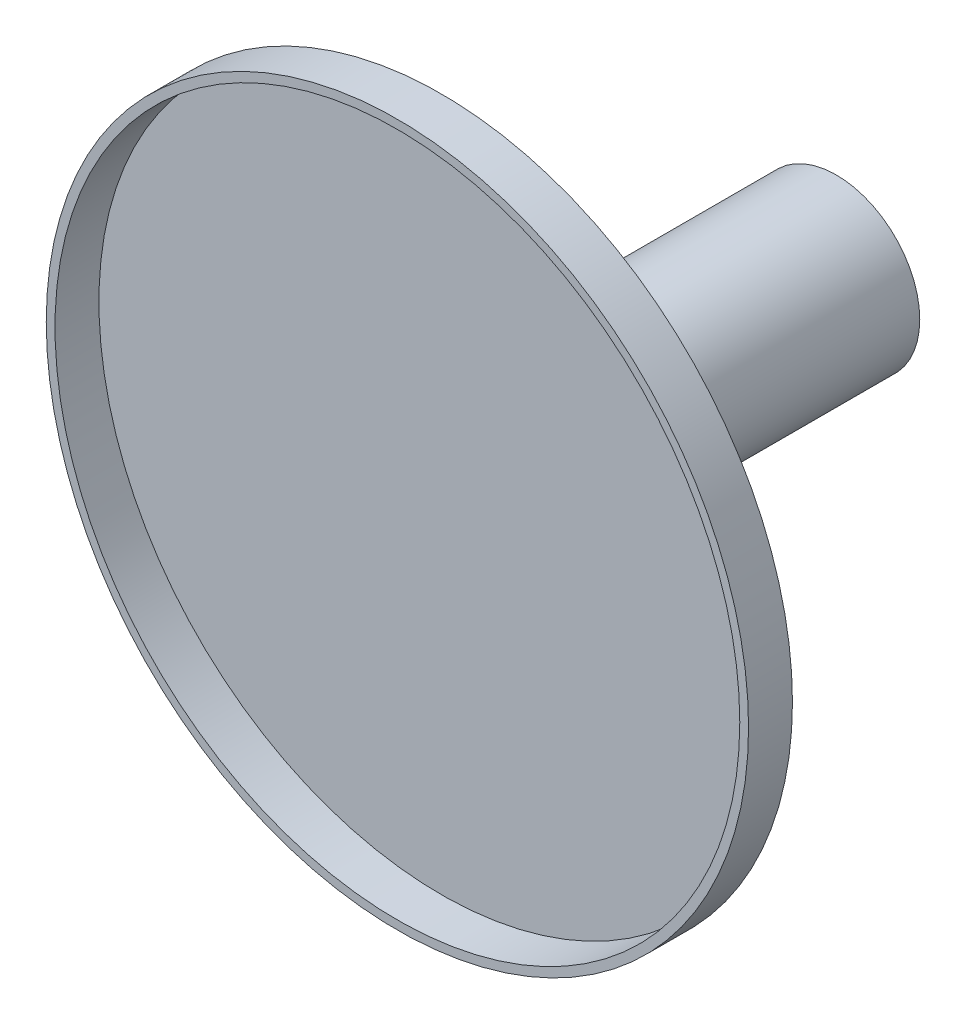
ISO-10303-21;
HEADER;
FILE_DESCRIPTION(('STEP AP214'),'2;1');
FILE_NAME('part.step','',(''),(''),'','','');
FILE_SCHEMA(('AUTOMOTIVE_DESIGN { 1 0 10303 214 1 1 1 1 }'));
ENDSEC;
DATA;
#1=APPLICATION_CONTEXT('core data for automotive mechanical design processes');
#2=APPLICATION_PROTOCOL_DEFINITION('international standard','automotive_design',2000,#1);
#3=PRODUCT_CONTEXT('',#1,'mechanical');
#4=PRODUCT('Part','Part','',(#3));
#5=PRODUCT_RELATED_PRODUCT_CATEGORY('part','',(#4));
#6=PRODUCT_DEFINITION_FORMATION('','',#4);
#7=PRODUCT_DEFINITION_CONTEXT('part definition',#1,'design');
#8=PRODUCT_DEFINITION('design','',#6,#7);
#9=PRODUCT_DEFINITION_SHAPE('','',#8);
#10=(LENGTH_UNIT() NAMED_UNIT(*) SI_UNIT(.MILLI.,.METRE.));
#11=(NAMED_UNIT(*) PLANE_ANGLE_UNIT() SI_UNIT($,.RADIAN.));
#12=(NAMED_UNIT(*) SI_UNIT($,.STERADIAN.) SOLID_ANGLE_UNIT());
#13=UNCERTAINTY_MEASURE_WITH_UNIT(LENGTH_MEASURE(1.E-05),#10,'distance_accuracy_value','');
#14=(GEOMETRIC_REPRESENTATION_CONTEXT(3) GLOBAL_UNCERTAINTY_ASSIGNED_CONTEXT((#13)) GLOBAL_UNIT_ASSIGNED_CONTEXT((#10,
#11,#12)) REPRESENTATION_CONTEXT('',''));
#15=CARTESIAN_POINT('',(0.,0.,0.));
#16=DIRECTION('',(0.,0.,1.));
#17=DIRECTION('',(1.,0.,0.));
#18=AXIS2_PLACEMENT_3D('',#15,#16,#17);
#19=CARTESIAN_POINT('',(0.,0.,12.7));
#20=DIRECTION('',(0.,0.,-1.));
#21=DIRECTION('',(-1.,0.,0.));
#22=AXIS2_PLACEMENT_3D('',#19,#20,#21);
#23=CYLINDRICAL_SURFACE('',#22,101.6);
#24=CARTESIAN_POINT('',(0.,0.,12.7));
#25=DIRECTION('',(0.,0.,1.));
#26=DIRECTION('',(1.,0.,0.));
#27=AXIS2_PLACEMENT_3D('',#24,#25,#26);
#28=CIRCLE('',#27,101.6);
#29=CARTESIAN_POINT('',(101.6,0.,12.7));
#30=VERTEX_POINT('',#29);
#31=EDGE_CURVE('E41',#30,#30,#28,.T.);
#32=ORIENTED_EDGE('',*,*,#31,.F.);
#33=EDGE_LOOP('',(#32));
#34=FACE_BOUND('',#33,.T.);
#35=CARTESIAN_POINT('',(0.,0.,0.));
#36=DIRECTION('',(0.,0.,1.));
#37=DIRECTION('',(1.,0.,0.));
#38=AXIS2_PLACEMENT_3D('',#35,#36,#37);
#39=CIRCLE('',#38,101.6);
#40=CARTESIAN_POINT('',(101.6,0.,0.));
#41=VERTEX_POINT('',#40);
#42=EDGE_CURVE('E93',#41,#41,#39,.T.);
#43=ORIENTED_EDGE('',*,*,#42,.T.);
#44=EDGE_LOOP('',(#43));
#45=FACE_BOUND('',#44,.T.);
#46=ADVANCED_FACE('F33',(#34,#45),#23,.T.);
#47=CARTESIAN_POINT('',(0.,0.,12.7));
#48=DIRECTION('',(0.,0.,1.));
#49=DIRECTION('',(1.,0.,0.));
#50=AXIS2_PLACEMENT_3D('',#47,#48,#49);
#51=PLANE('',#50);
#52=CARTESIAN_POINT('',(0.,0.,12.7));
#53=DIRECTION('',(0.,0.,1.));
#54=DIRECTION('',(1.,0.,0.));
#55=AXIS2_PLACEMENT_3D('',#52,#53,#54);
#56=CIRCLE('',#55,99.06);
#57=CARTESIAN_POINT('',(99.06,0.,12.7));
#58=VERTEX_POINT('',#57);
#59=EDGE_CURVE('E96',#58,#58,#56,.T.);
#60=ORIENTED_EDGE('',*,*,#59,.F.);
#61=EDGE_LOOP('',(#60));
#62=FACE_BOUND('',#61,.T.);
#63=ORIENTED_EDGE('',*,*,#31,.T.);
#64=EDGE_LOOP('',(#63));
#65=FACE_BOUND('',#64,.T.);
#66=ADVANCED_FACE('F106',(#62,#65),#51,.T.);
#67=CARTESIAN_POINT('',(0.,0.,-25.4));
#68=DIRECTION('',(0.,0.,1.));
#69=DIRECTION('',(1.,0.,0.));
#70=AXIS2_PLACEMENT_3D('',#67,#68,#69);
#71=CYLINDRICAL_SURFACE('',#70,99.06);
#72=CARTESIAN_POINT('',(0.,0.,0.));
#73=DIRECTION('',(0.,0.,1.));
#74=DIRECTION('',(1.,0.,0.));
#75=AXIS2_PLACEMENT_3D('',#72,#73,#74);
#76=CIRCLE('',#75,99.06);
#77=CARTESIAN_POINT('',(99.06,0.,0.));
#78=VERTEX_POINT('',#77);
#79=EDGE_CURVE('E46',#78,#78,#76,.T.);
#80=CARTESIAN_POINT('',(99.06,0.,12.7));
#81=CARTESIAN_POINT('',(99.06,0.,12.5677083333333));
#82=CARTESIAN_POINT('',(99.06,0.,12.4354166666667));
#83=CARTESIAN_POINT('',(99.06,0.,12.1708333333333));
#84=CARTESIAN_POINT('',(99.06,0.,12.0385416666667));
#85=CARTESIAN_POINT('',(99.06,0.,11.7739583333333));
#86=CARTESIAN_POINT('',(99.06,0.,11.6416666666667));
#87=CARTESIAN_POINT('',(99.06,0.,11.3770833333333));
#88=CARTESIAN_POINT('',(99.06,0.,11.2447916666667));
#89=CARTESIAN_POINT('',(99.06,0.,10.9802083333333));
#90=CARTESIAN_POINT('',(99.06,0.,10.8479166666667));
#91=CARTESIAN_POINT('',(99.06,0.,10.5833333333333));
#92=CARTESIAN_POINT('',(99.06,0.,10.4510416666667));
#93=CARTESIAN_POINT('',(99.06,0.,10.1864583333333));
#94=CARTESIAN_POINT('',(99.06,0.,10.0541666666667));
#95=CARTESIAN_POINT('',(99.06,0.,9.78958333333333));
#96=CARTESIAN_POINT('',(99.06,0.,9.65729166666667));
#97=CARTESIAN_POINT('',(99.06,0.,9.39270833333333));
#98=CARTESIAN_POINT('',(99.06,0.,9.26041666666666));
#99=CARTESIAN_POINT('',(99.06,0.,8.99583333333333));
#100=CARTESIAN_POINT('',(99.06,0.,8.86354166666666));
#101=CARTESIAN_POINT('',(99.06,0.,8.59895833333333));
#102=CARTESIAN_POINT('',(99.06,0.,8.46666666666667));
#103=CARTESIAN_POINT('',(99.06,0.,8.20208333333333));
#104=CARTESIAN_POINT('',(99.06,0.,8.06979166666666));
#105=CARTESIAN_POINT('',(99.06,0.,7.80520833333333));
#106=CARTESIAN_POINT('',(99.06,0.,7.67291666666666));
#107=CARTESIAN_POINT('',(99.06,0.,7.40833333333333));
#108=CARTESIAN_POINT('',(99.06,0.,7.27604166666667));
#109=CARTESIAN_POINT('',(99.06,0.,7.01145833333333));
#110=CARTESIAN_POINT('',(99.06,0.,6.87916666666666));
#111=CARTESIAN_POINT('',(99.06,0.,6.61458333333333));
#112=CARTESIAN_POINT('',(99.06,0.,6.48229166666666));
#113=CARTESIAN_POINT('',(99.06,0.,6.21770833333333));
#114=CARTESIAN_POINT('',(99.06,0.,6.08541666666667));
#115=CARTESIAN_POINT('',(99.06,0.,5.82083333333333));
#116=CARTESIAN_POINT('',(99.06,0.,5.68854166666667));
#117=CARTESIAN_POINT('',(99.06,0.,5.42395833333333));
#118=CARTESIAN_POINT('',(99.06,0.,5.29166666666667));
#119=CARTESIAN_POINT('',(99.06,0.,5.02708333333333));
#120=CARTESIAN_POINT('',(99.06,0.,4.89479166666667));
#121=CARTESIAN_POINT('',(99.06,0.,4.63020833333334));
#122=CARTESIAN_POINT('',(99.06,0.,4.49791666666667));
#123=CARTESIAN_POINT('',(99.06,0.,4.23333333333333));
#124=CARTESIAN_POINT('',(99.06,0.,4.10104166666667));
#125=CARTESIAN_POINT('',(99.06,0.,3.83645833333333));
#126=CARTESIAN_POINT('',(99.06,0.,3.70416666666667));
#127=CARTESIAN_POINT('',(99.06,0.,3.43958333333333));
#128=CARTESIAN_POINT('',(99.06,0.,3.30729166666667));
#129=CARTESIAN_POINT('',(99.06,0.,3.04270833333333));
#130=CARTESIAN_POINT('',(99.06,0.,2.91041666666667));
#131=CARTESIAN_POINT('',(99.06,0.,2.64583333333333));
#132=CARTESIAN_POINT('',(99.06,0.,2.51354166666667));
#133=CARTESIAN_POINT('',(99.06,0.,2.24895833333333));
#134=CARTESIAN_POINT('',(99.06,0.,2.11666666666667));
#135=CARTESIAN_POINT('',(99.06,0.,1.85208333333333));
#136=CARTESIAN_POINT('',(99.06,0.,1.71979166666667));
#137=CARTESIAN_POINT('',(99.06,0.,1.45520833333333));
#138=CARTESIAN_POINT('',(99.06,0.,1.32291666666667));
#139=CARTESIAN_POINT('',(99.06,0.,1.05833333333333));
#140=CARTESIAN_POINT('',(99.06,0.,0.926041666666666));
#141=CARTESIAN_POINT('',(99.06,0.,0.661458333333332));
#142=CARTESIAN_POINT('',(99.06,0.,0.529166666666665));
#143=CARTESIAN_POINT('',(99.06,0.,0.264583333333332));
#144=CARTESIAN_POINT('',(99.06,0.,0.132291666666666));
#145=CARTESIAN_POINT('',(99.06,0.,0.));
#146=B_SPLINE_CURVE_WITH_KNOTS('',3,(#80,#81,#82,#83,#84,#85,#86,#87,#88,#89,#90,#91,#92,#93,
#94,#95,#96,#97,#98,#99,#100,#101,#102,#103,#104,#105,#106,#107,#108,#109,#110,#111,#112,#113,
#114,#115,#116,#117,#118,#119,#120,#121,#122,#123,#124,#125,#126,#127,#128,#129,#130,#131,#132,
#133,#134,#135,#136,#137,#138,#139,#140,#141,#142,#143,#144,#145),.UNSPECIFIED.,.F.,.F.,(4,2,2,
2,2,2,2,2,2,2,2,2,2,2,2,2,2,2,2,2,2,2,2,2,2,2,2,2,2,2,2,2,4),(0.,0.396874999999998,
0.793750000000003,1.190625,1.5875,1.984375,2.38125,2.778125,3.175,3.571875,3.96875,4.365625,
4.7625,5.159375,5.55625,5.953125,6.35,6.746875,7.14375,7.540625,7.9375,8.334375,8.73125,
9.128125,9.525,9.921875,10.31875,10.715625,11.1125,11.509375,11.90625,12.303125,12.7),.UNSPECIFIED.);
#147=EDGE_CURVE('BSEAM104',#58,#78,#146,.T.);
#148=ORIENTED_EDGE('',*,*,#59,.T.);
#149=ORIENTED_EDGE('',*,*,#79,.F.);
#150=ORIENTED_EDGE('',*,*,#147,.T.);
#151=ORIENTED_EDGE('',*,*,#147,.F.);
#152=EDGE_LOOP('',(#148,#150,#149,#151));
#153=FACE_BOUND('',#152,.T.);
#154=ADVANCED_FACE('F104',(#153),#71,.F.);
#155=CARTESIAN_POINT('',(0.,0.,0.));
#156=DIRECTION('',(0.,0.,1.));
#157=DIRECTION('',(1.,0.,0.));
#158=AXIS2_PLACEMENT_3D('',#155,#156,#157);
#159=PLANE('',#158);
#160=ORIENTED_EDGE('',*,*,#79,.T.);
#161=EDGE_LOOP('',(#160));
#162=FACE_BOUND('',#161,.T.);
#163=ADVANCED_FACE('F78',(#162),#159,.T.);
#164=CARTESIAN_POINT('',(0.,0.,-38.1));
#165=DIRECTION('',(0.,0.,1.));
#166=DIRECTION('',(1.,0.,0.));
#167=AXIS2_PLACEMENT_3D('',#164,#165,#166);
#168=CONICAL_SURFACE('',#167,24.13,1.11372757024711);
#169=CARTESIAN_POINT('',(0.,0.,-38.1));
#170=DIRECTION('',(0.,0.,-1.));
#171=DIRECTION('',(-1.,0.,0.));
#172=AXIS2_PLACEMENT_3D('',#169,#170,#171);
#173=CIRCLE('',#172,24.13);
#174=CARTESIAN_POINT('',(24.13,0.,-38.1));
#175=VERTEX_POINT('',#174);
#176=EDGE_CURVE('E36',#175,#175,#173,.T.);
#177=CARTESIAN_POINT('',(24.13,0.,-38.1));
#178=CARTESIAN_POINT('',(24.9369791666667,0.,-37.703125));
#179=CARTESIAN_POINT('',(25.7439583333333,0.,-37.30625));
#180=CARTESIAN_POINT('',(27.3579166666667,0.,-36.5125));
#181=CARTESIAN_POINT('',(28.1648958333333,0.,-36.115625));
#182=CARTESIAN_POINT('',(29.7788541666667,0.,-35.321875));
#183=CARTESIAN_POINT('',(30.5858333333333,0.,-34.925));
#184=CARTESIAN_POINT('',(32.1997916666667,0.,-34.13125));
#185=CARTESIAN_POINT('',(33.0067708333333,0.,-33.734375));
#186=CARTESIAN_POINT('',(34.6207291666667,0.,-32.940625));
#187=CARTESIAN_POINT('',(35.4277083333333,0.,-32.54375));
#188=CARTESIAN_POINT('',(37.0416666666667,0.,-31.75));
#189=CARTESIAN_POINT('',(37.8486458333333,0.,-31.353125));
#190=CARTESIAN_POINT('',(39.4626041666667,0.,-30.559375));
#191=CARTESIAN_POINT('',(40.2695833333333,0.,-30.1625));
#192=CARTESIAN_POINT('',(41.8835416666667,0.,-29.36875));
#193=CARTESIAN_POINT('',(42.6905208333333,0.,-28.971875));
#194=CARTESIAN_POINT('',(44.3044791666667,0.,-28.178125));
#195=CARTESIAN_POINT('',(45.1114583333333,0.,-27.78125));
#196=CARTESIAN_POINT('',(46.7254166666667,0.,-26.9875));
#197=CARTESIAN_POINT('',(47.5323958333333,0.,-26.590625));
#198=CARTESIAN_POINT('',(49.1463541666667,0.,-25.796875));
#199=CARTESIAN_POINT('',(49.9533333333333,0.,-25.4));
#200=CARTESIAN_POINT('',(51.5672916666667,0.,-24.60625));
#201=CARTESIAN_POINT('',(52.3742708333333,0.,-24.209375));
#202=CARTESIAN_POINT('',(53.9882291666667,0.,-23.415625));
#203=CARTESIAN_POINT('',(54.7952083333333,0.,-23.01875));
#204=CARTESIAN_POINT('',(56.4091666666667,0.,-22.225));
#205=CARTESIAN_POINT('',(57.2161458333333,0.,-21.828125));
#206=CARTESIAN_POINT('',(58.8301041666667,0.,-21.034375));
#207=CARTESIAN_POINT('',(59.6370833333333,0.,-20.6375));
#208=CARTESIAN_POINT('',(61.2510416666667,0.,-19.84375));
#209=CARTESIAN_POINT('',(62.0580208333333,0.,-19.446875));
#210=CARTESIAN_POINT('',(63.6719791666667,0.,-18.653125));
#211=CARTESIAN_POINT('',(64.4789583333333,0.,-18.25625));
#212=CARTESIAN_POINT('',(66.0929166666667,0.,-17.4625));
#213=CARTESIAN_POINT('',(66.8998958333333,0.,-17.065625));
#214=CARTESIAN_POINT('',(68.5138541666666,0.,-16.271875));
#215=CARTESIAN_POINT('',(69.3208333333333,0.,-15.875));
#216=CARTESIAN_POINT('',(70.9347916666667,0.,-15.08125));
#217=CARTESIAN_POINT('',(71.7417708333333,0.,-14.684375));
#218=CARTESIAN_POINT('',(73.3557291666667,0.,-13.890625));
#219=CARTESIAN_POINT('',(74.1627083333333,0.,-13.49375));
#220=CARTESIAN_POINT('',(75.7766666666667,0.,-12.7));
#221=CARTESIAN_POINT('',(76.5836458333333,0.,-12.303125));
#222=CARTESIAN_POINT('',(78.1976041666667,0.,-11.509375));
#223=CARTESIAN_POINT('',(79.0045833333333,0.,-11.1125));
#224=CARTESIAN_POINT('',(80.6185416666667,0.,-10.31875));
#225=CARTESIAN_POINT('',(81.4255208333333,0.,-9.92187500000001));
#226=CARTESIAN_POINT('',(83.0394791666667,0.,-9.12812500000001));
#227=CARTESIAN_POINT('',(83.8464583333333,0.,-8.73125000000001));
#228=CARTESIAN_POINT('',(85.4604166666666,0.,-7.93750000000001));
#229=CARTESIAN_POINT('',(86.2673958333333,0.,-7.54062500000001));
#230=CARTESIAN_POINT('',(87.8813541666667,0.,-6.74687500000001));
#231=CARTESIAN_POINT('',(88.6883333333333,0.,-6.35));
#232=CARTESIAN_POINT('',(90.3022916666667,0.,-5.55625));
#233=CARTESIAN_POINT('',(91.1092708333333,0.,-5.159375));
#234=CARTESIAN_POINT('',(92.7232291666667,0.,-4.365625));
#235=CARTESIAN_POINT('',(93.5302083333333,0.,-3.96875000000001));
#236=CARTESIAN_POINT('',(95.1441666666666,0.,-3.17500000000001));
#237=CARTESIAN_POINT('',(95.9511458333333,0.,-2.77812500000001));
#238=CARTESIAN_POINT('',(97.5651041666667,0.,-1.98437500000001));
#239=CARTESIAN_POINT('',(98.3720833333333,0.,-1.58750000000001));
#240=CARTESIAN_POINT('',(99.9860416666667,0.,-0.793750000000007));
#241=CARTESIAN_POINT('',(100.793020833333,0.,-0.396875000000006));
#242=CARTESIAN_POINT('',(101.6,0.,0.));
#243=B_SPLINE_CURVE_WITH_KNOTS('',3,(#177,#178,#179,#180,#181,#182,#183,#184,#185,#186,#187,
#188,#189,#190,#191,#192,#193,#194,#195,#196,#197,#198,#199,#200,#201,#202,#203,#204,#205,#206,
#207,#208,#209,#210,#211,#212,#213,#214,#215,#216,#217,#218,#219,#220,#221,#222,#223,#224,#225,
#226,#227,#228,#229,#230,#231,#232,#233,#234,#235,#236,#237,#238,#239,#240,#241,#242),
.UNSPECIFIED.,.F.,.F.,(4,2,2,2,2,2,2,2,2,2,2,2,2,2,2,2,2,2,2,2,2,2,2,2,2,2,2,2,2,2,2,2,4),(0.,
2.69787439839797,5.39574879679595,8.09362319519393,10.7914975935919,13.4893719919899,
16.1872463903879,18.8851207887858,21.5829951871838,24.2808695855818,26.9787439839798,
29.6766183823777,32.3744927807757,35.0723671791737,37.7702415775717,40.4681159759697,
43.1659903743676,45.8638647727656,48.5617391711636,51.2596135695616,53.9574879679596,
56.6553623663575,59.3532367647555,62.0511111631535,64.7489855615515,67.4468599599494,
70.1447343583474,72.8426087567454,75.5404831551434,78.2383575535413,80.9362319519393,
83.6341063503373,86.3319807487352),.UNSPECIFIED.);
#244=EDGE_CURVE('BSEAM74',#175,#41,#243,.T.);
#245=ORIENTED_EDGE('',*,*,#176,.F.);
#246=ORIENTED_EDGE('',*,*,#42,.F.);
#247=ORIENTED_EDGE('',*,*,#244,.T.);
#248=ORIENTED_EDGE('',*,*,#244,.F.);
#249=EDGE_LOOP('',(#245,#247,#246,#248));
#250=FACE_BOUND('',#249,.T.);
#251=ADVANCED_FACE('F74',(#250),#168,.T.);
#252=CARTESIAN_POINT('',(0.,0.,-114.3));
#253=DIRECTION('',(0.,0.,-1.));
#254=DIRECTION('',(-1.,0.,0.));
#255=AXIS2_PLACEMENT_3D('',#252,#253,#254);
#256=PLANE('',#255);
#257=CARTESIAN_POINT('',(0.,0.,-114.3));
#258=DIRECTION('',(0.,0.,-1.));
#259=DIRECTION('',(-1.,0.,0.));
#260=AXIS2_PLACEMENT_3D('',#257,#258,#259);
#261=CIRCLE('',#260,24.13);
#262=CARTESIAN_POINT('',(24.13,0.,-114.3));
#263=VERTEX_POINT('',#262);
#264=EDGE_CURVE('E177',#263,#263,#261,.T.);
#265=ORIENTED_EDGE('',*,*,#264,.T.);
#266=EDGE_LOOP('',(#265));
#267=FACE_BOUND('',#266,.T.);
#268=CARTESIAN_POINT('',(0.,0.,-114.3));
#269=DIRECTION('',(0.,0.,-1.));
#270=DIRECTION('',(-1.,0.,0.));
#271=AXIS2_PLACEMENT_3D('',#268,#269,#270);
#272=CIRCLE('',#271,20.828);
#273=CARTESIAN_POINT('',(20.828,0.,-114.3));
#274=VERTEX_POINT('',#273);
#275=EDGE_CURVE('E175',#274,#274,#272,.T.);
#276=ORIENTED_EDGE('',*,*,#275,.F.);
#277=EDGE_LOOP('',(#276));
#278=FACE_BOUND('',#277,.T.);
#279=ADVANCED_FACE('F67',(#267,#278),#256,.T.);
#280=CARTESIAN_POINT('',(0.,0.,-114.3));
#281=DIRECTION('',(0.,0.,1.));
#282=DIRECTION('',(1.,0.,0.));
#283=AXIS2_PLACEMENT_3D('',#280,#281,#282);
#284=CYLINDRICAL_SURFACE('',#283,24.13);
#285=CARTESIAN_POINT('',(24.13,0.,-114.3));
#286=CARTESIAN_POINT('',(24.13,0.,-113.50625));
#287=CARTESIAN_POINT('',(24.13,0.,-112.7125));
#288=CARTESIAN_POINT('',(24.13,0.,-111.125));
#289=CARTESIAN_POINT('',(24.13,0.,-110.33125));
#290=CARTESIAN_POINT('',(24.13,0.,-108.74375));
#291=CARTESIAN_POINT('',(24.13,0.,-107.95));
#292=CARTESIAN_POINT('',(24.13,0.,-106.3625));
#293=CARTESIAN_POINT('',(24.13,0.,-105.56875));
#294=CARTESIAN_POINT('',(24.13,0.,-103.98125));
#295=CARTESIAN_POINT('',(24.13,0.,-103.1875));
#296=CARTESIAN_POINT('',(24.13,0.,-101.6));
#297=CARTESIAN_POINT('',(24.13,0.,-100.80625));
#298=CARTESIAN_POINT('',(24.13,0.,-99.21875));
#299=CARTESIAN_POINT('',(24.13,0.,-98.425));
#300=CARTESIAN_POINT('',(24.13,0.,-96.8375));
#301=CARTESIAN_POINT('',(24.13,0.,-96.04375));
#302=CARTESIAN_POINT('',(24.13,0.,-94.45625));
#303=CARTESIAN_POINT('',(24.13,0.,-93.6625));
#304=CARTESIAN_POINT('',(24.13,0.,-92.075));
#305=CARTESIAN_POINT('',(24.13,0.,-91.28125));
#306=CARTESIAN_POINT('',(24.13,0.,-89.69375));
#307=CARTESIAN_POINT('',(24.13,0.,-88.9));
#308=CARTESIAN_POINT('',(24.13,0.,-87.3125));
#309=CARTESIAN_POINT('',(24.13,0.,-86.51875));
#310=CARTESIAN_POINT('',(24.13,0.,-84.93125));
#311=CARTESIAN_POINT('',(24.13,0.,-84.1375));
#312=CARTESIAN_POINT('',(24.13,0.,-82.55));
#313=CARTESIAN_POINT('',(24.13,0.,-81.75625));
#314=CARTESIAN_POINT('',(24.13,0.,-80.16875));
#315=CARTESIAN_POINT('',(24.13,0.,-79.375));
#316=CARTESIAN_POINT('',(24.13,0.,-77.7875));
#317=CARTESIAN_POINT('',(24.13,0.,-76.99375));
#318=CARTESIAN_POINT('',(24.13,0.,-75.40625));
#319=CARTESIAN_POINT('',(24.13,0.,-74.6125));
#320=CARTESIAN_POINT('',(24.13,0.,-73.025));
#321=CARTESIAN_POINT('',(24.13,0.,-72.23125));
#322=CARTESIAN_POINT('',(24.13,0.,-70.64375));
#323=CARTESIAN_POINT('',(24.13,0.,-69.85));
#324=CARTESIAN_POINT('',(24.13,0.,-68.2625));
#325=CARTESIAN_POINT('',(24.13,0.,-67.46875));
#326=CARTESIAN_POINT('',(24.13,0.,-65.88125));
#327=CARTESIAN_POINT('',(24.13,0.,-65.0875));
#328=CARTESIAN_POINT('',(24.13,0.,-63.5));
#329=CARTESIAN_POINT('',(24.13,0.,-62.70625));
#330=CARTESIAN_POINT('',(24.13,0.,-61.11875));
#331=CARTESIAN_POINT('',(24.13,0.,-60.325));
#332=CARTESIAN_POINT('',(24.13,0.,-58.7375));
#333=CARTESIAN_POINT('',(24.13,0.,-57.94375));
#334=CARTESIAN_POINT('',(24.13,0.,-56.35625));
#335=CARTESIAN_POINT('',(24.13,0.,-55.5625));
#336=CARTESIAN_POINT('',(24.13,0.,-53.975));
#337=CARTESIAN_POINT('',(24.13,0.,-53.18125));
#338=CARTESIAN_POINT('',(24.13,0.,-51.59375));
#339=CARTESIAN_POINT('',(24.13,0.,-50.8));
#340=CARTESIAN_POINT('',(24.13,0.,-49.2125));
#341=CARTESIAN_POINT('',(24.13,0.,-48.41875));
#342=CARTESIAN_POINT('',(24.13,0.,-46.83125));
#343=CARTESIAN_POINT('',(24.13,0.,-46.0375));
#344=CARTESIAN_POINT('',(24.13,0.,-44.45));
#345=CARTESIAN_POINT('',(24.13,0.,-43.65625));
#346=CARTESIAN_POINT('',(24.13,0.,-42.06875));
#347=CARTESIAN_POINT('',(24.13,0.,-41.275));
#348=CARTESIAN_POINT('',(24.13,0.,-39.6875));
#349=CARTESIAN_POINT('',(24.13,0.,-38.89375));
#350=CARTESIAN_POINT('',(24.13,0.,-38.1));
#351=B_SPLINE_CURVE_WITH_KNOTS('',3,(#285,#286,#287,#288,#289,#290,#291,#292,#293,#294,#295,
#296,#297,#298,#299,#300,#301,#302,#303,#304,#305,#306,#307,#308,#309,#310,#311,#312,#313,#314,
#315,#316,#317,#318,#319,#320,#321,#322,#323,#324,#325,#326,#327,#328,#329,#330,#331,#332,#333,
#334,#335,#336,#337,#338,#339,#340,#341,#342,#343,#344,#345,#346,#347,#348,#349,#350),
.UNSPECIFIED.,.F.,.F.,(4,2,2,2,2,2,2,2,2,2,2,2,2,2,2,2,2,2,2,2,2,2,2,2,2,2,2,2,2,2,2,2,4),(0.,
2.38125,4.7625,7.14375,9.52500000000001,11.90625,14.2875,16.66875,19.05,21.43125,23.8125,
26.19375,28.575,30.95625,33.3375,35.71875,38.1,40.48125,42.8625,45.24375,47.625,50.00625,
52.3875,54.76875,57.15,59.53125,61.9125,64.29375,66.675,69.05625,71.4375,73.81875,76.2),.UNSPECIFIED.);
#352=EDGE_CURVE('BSEAM56',#263,#175,#351,.T.);
#353=ORIENTED_EDGE('',*,*,#264,.F.);
#354=ORIENTED_EDGE('',*,*,#176,.T.);
#355=ORIENTED_EDGE('',*,*,#352,.T.);
#356=ORIENTED_EDGE('',*,*,#352,.F.);
#357=EDGE_LOOP('',(#353,#355,#354,#356));
#358=FACE_BOUND('',#357,.T.);
#359=ADVANCED_FACE('F56',(#358),#284,.T.);
#360=CARTESIAN_POINT('',(0.,0.,-114.3));
#361=DIRECTION('',(0.,0.,1.));
#362=DIRECTION('',(1.,0.,0.));
#363=AXIS2_PLACEMENT_3D('',#360,#361,#362);
#364=CYLINDRICAL_SURFACE('',#363,20.828);
#365=CARTESIAN_POINT('',(0.,0.,-38.1));
#366=DIRECTION('',(0.,0.,-1.));
#367=DIRECTION('',(-1.,0.,0.));
#368=AXIS2_PLACEMENT_3D('',#365,#366,#367);
#369=CIRCLE('',#368,20.828);
#370=CARTESIAN_POINT('',(20.828,0.,-38.1));
#371=VERTEX_POINT('',#370);
#372=EDGE_CURVE('E11',#371,#371,#369,.F.);
#373=CARTESIAN_POINT('',(20.828,0.,-114.3));
#374=CARTESIAN_POINT('',(20.828,0.,-113.50625));
#375=CARTESIAN_POINT('',(20.828,0.,-112.7125));
#376=CARTESIAN_POINT('',(20.828,0.,-111.125));
#377=CARTESIAN_POINT('',(20.828,0.,-110.33125));
#378=CARTESIAN_POINT('',(20.828,0.,-108.74375));
#379=CARTESIAN_POINT('',(20.828,0.,-107.95));
#380=CARTESIAN_POINT('',(20.828,0.,-106.3625));
#381=CARTESIAN_POINT('',(20.828,0.,-105.56875));
#382=CARTESIAN_POINT('',(20.828,0.,-103.98125));
#383=CARTESIAN_POINT('',(20.828,0.,-103.1875));
#384=CARTESIAN_POINT('',(20.828,0.,-101.6));
#385=CARTESIAN_POINT('',(20.828,0.,-100.80625));
#386=CARTESIAN_POINT('',(20.828,0.,-99.21875));
#387=CARTESIAN_POINT('',(20.828,0.,-98.425));
#388=CARTESIAN_POINT('',(20.828,0.,-96.8375));
#389=CARTESIAN_POINT('',(20.828,0.,-96.04375));
#390=CARTESIAN_POINT('',(20.828,0.,-94.45625));
#391=CARTESIAN_POINT('',(20.828,0.,-93.6625));
#392=CARTESIAN_POINT('',(20.828,0.,-92.075));
#393=CARTESIAN_POINT('',(20.828,0.,-91.28125));
#394=CARTESIAN_POINT('',(20.828,0.,-89.69375));
#395=CARTESIAN_POINT('',(20.828,0.,-88.9));
#396=CARTESIAN_POINT('',(20.828,0.,-87.3125));
#397=CARTESIAN_POINT('',(20.828,0.,-86.51875));
#398=CARTESIAN_POINT('',(20.828,0.,-84.93125));
#399=CARTESIAN_POINT('',(20.828,0.,-84.1375));
#400=CARTESIAN_POINT('',(20.828,0.,-82.55));
#401=CARTESIAN_POINT('',(20.828,0.,-81.75625));
#402=CARTESIAN_POINT('',(20.828,0.,-80.16875));
#403=CARTESIAN_POINT('',(20.828,0.,-79.375));
#404=CARTESIAN_POINT('',(20.828,0.,-77.7875));
#405=CARTESIAN_POINT('',(20.828,0.,-76.99375));
#406=CARTESIAN_POINT('',(20.828,0.,-75.40625));
#407=CARTESIAN_POINT('',(20.828,0.,-74.6125));
#408=CARTESIAN_POINT('',(20.828,0.,-73.025));
#409=CARTESIAN_POINT('',(20.828,0.,-72.23125));
#410=CARTESIAN_POINT('',(20.828,0.,-70.64375));
#411=CARTESIAN_POINT('',(20.828,0.,-69.85));
#412=CARTESIAN_POINT('',(20.828,0.,-68.2625));
#413=CARTESIAN_POINT('',(20.828,0.,-67.46875));
#414=CARTESIAN_POINT('',(20.828,0.,-65.88125));
#415=CARTESIAN_POINT('',(20.828,0.,-65.0875));
#416=CARTESIAN_POINT('',(20.828,0.,-63.5));
#417=CARTESIAN_POINT('',(20.828,0.,-62.70625));
#418=CARTESIAN_POINT('',(20.828,0.,-61.11875));
#419=CARTESIAN_POINT('',(20.828,0.,-60.325));
#420=CARTESIAN_POINT('',(20.828,0.,-58.7375));
#421=CARTESIAN_POINT('',(20.828,0.,-57.94375));
#422=CARTESIAN_POINT('',(20.828,0.,-56.35625));
#423=CARTESIAN_POINT('',(20.828,0.,-55.5625));
#424=CARTESIAN_POINT('',(20.828,0.,-53.975));
#425=CARTESIAN_POINT('',(20.828,0.,-53.18125));
#426=CARTESIAN_POINT('',(20.828,0.,-51.59375));
#427=CARTESIAN_POINT('',(20.828,0.,-50.8));
#428=CARTESIAN_POINT('',(20.828,0.,-49.2125));
#429=CARTESIAN_POINT('',(20.828,0.,-48.41875));
#430=CARTESIAN_POINT('',(20.828,0.,-46.83125));
#431=CARTESIAN_POINT('',(20.828,0.,-46.0375));
#432=CARTESIAN_POINT('',(20.828,0.,-44.45));
#433=CARTESIAN_POINT('',(20.828,0.,-43.65625));
#434=CARTESIAN_POINT('',(20.828,0.,-42.06875));
#435=CARTESIAN_POINT('',(20.828,0.,-41.275));
#436=CARTESIAN_POINT('',(20.828,0.,-39.6875));
#437=CARTESIAN_POINT('',(20.828,0.,-38.89375));
#438=CARTESIAN_POINT('',(20.828,0.,-38.1));
#439=B_SPLINE_CURVE_WITH_KNOTS('',3,(#373,#374,#375,#376,#377,#378,#379,#380,#381,#382,#383,
#384,#385,#386,#387,#388,#389,#390,#391,#392,#393,#394,#395,#396,#397,#398,#399,#400,#401,#402,
#403,#404,#405,#406,#407,#408,#409,#410,#411,#412,#413,#414,#415,#416,#417,#418,#419,#420,#421,
#422,#423,#424,#425,#426,#427,#428,#429,#430,#431,#432,#433,#434,#435,#436,#437,#438),
.UNSPECIFIED.,.F.,.F.,(4,2,2,2,2,2,2,2,2,2,2,2,2,2,2,2,2,2,2,2,2,2,2,2,2,2,2,2,2,2,2,2,4),(0.,
2.38125,4.7625,7.14375,9.52500000000001,11.90625,14.2875,16.66875,19.05,21.43125,23.8125,
26.19375,28.575,30.95625,33.3375,35.71875,38.1,40.48125,42.8625,45.24375,47.625,50.00625,
52.3875,54.76875,57.15,59.53125,61.9125,64.29375,66.675,69.05625,71.4375,73.81875,76.2),.UNSPECIFIED.);
#440=EDGE_CURVE('BSEAM66',#274,#371,#439,.T.);
#441=ORIENTED_EDGE('',*,*,#275,.T.);
#442=ORIENTED_EDGE('',*,*,#372,.T.);
#443=ORIENTED_EDGE('',*,*,#440,.T.);
#444=ORIENTED_EDGE('',*,*,#440,.F.);
#445=EDGE_LOOP('',(#441,#443,#442,#444));
#446=FACE_BOUND('',#445,.T.);
#447=ADVANCED_FACE('F66',(#446),#364,.F.);
#448=CARTESIAN_POINT('',(0.,0.,-38.1));
#449=DIRECTION('',(0.,0.,-1.));
#450=DIRECTION('',(-1.,0.,0.));
#451=AXIS2_PLACEMENT_3D('',#448,#449,#450);
#452=PLANE('',#451);
#453=ORIENTED_EDGE('',*,*,#372,.F.);
#454=EDGE_LOOP('',(#453));
#455=FACE_BOUND('',#454,.T.);
#456=ADVANCED_FACE('F70',(#455),#452,.T.);
#457=CLOSED_SHELL('',(#46,#66,#154,#163,#251,#279,#359,#447,#456));
#458=MANIFOLD_SOLID_BREP('B2',#457);
#459=ADVANCED_BREP_SHAPE_REPRESENTATION('',(#18,#458),#14);
#460=SHAPE_DEFINITION_REPRESENTATION(#9,#459);
ENDSEC;
END-ISO-10303-21;
